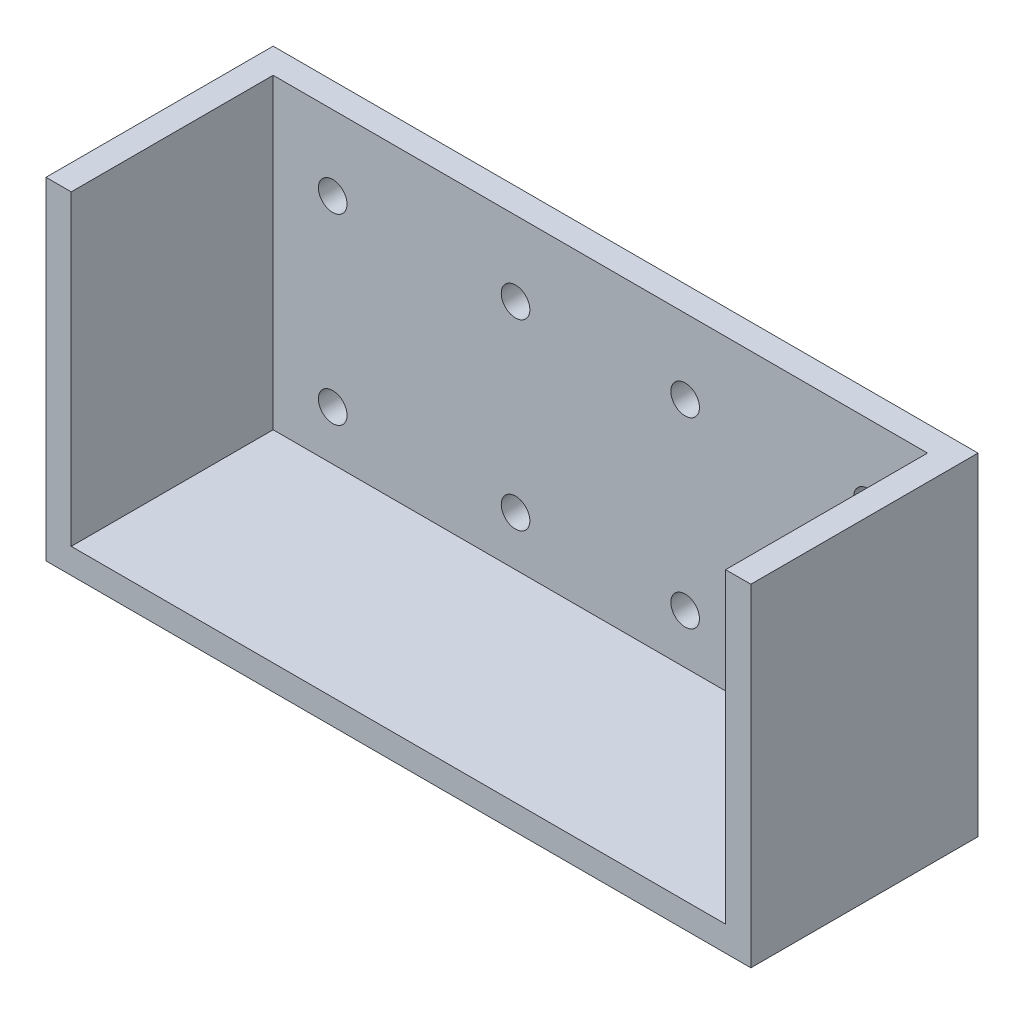
ISO-10303-21;
HEADER;
FILE_DESCRIPTION(('STEP AP214'),'2;1');
FILE_NAME('part.step','',(''),(''),'','','');
FILE_SCHEMA(('AUTOMOTIVE_DESIGN { 1 0 10303 214 1 1 1 1 }'));
ENDSEC;
DATA;
#1=APPLICATION_CONTEXT('core data for automotive mechanical design processes');
#2=APPLICATION_PROTOCOL_DEFINITION('international standard','automotive_design',2000,#1);
#3=PRODUCT_CONTEXT('',#1,'mechanical');
#4=PRODUCT('Part','Part','',(#3));
#5=PRODUCT_RELATED_PRODUCT_CATEGORY('part','',(#4));
#6=PRODUCT_DEFINITION_FORMATION('','',#4);
#7=PRODUCT_DEFINITION_CONTEXT('part definition',#1,'design');
#8=PRODUCT_DEFINITION('design','',#6,#7);
#9=PRODUCT_DEFINITION_SHAPE('','',#8);
#10=(LENGTH_UNIT() NAMED_UNIT(*) SI_UNIT(.MILLI.,.METRE.));
#11=(NAMED_UNIT(*) PLANE_ANGLE_UNIT() SI_UNIT($,.RADIAN.));
#12=(NAMED_UNIT(*) SI_UNIT($,.STERADIAN.) SOLID_ANGLE_UNIT());
#13=UNCERTAINTY_MEASURE_WITH_UNIT(LENGTH_MEASURE(1.E-05),#10,'distance_accuracy_value','');
#14=(GEOMETRIC_REPRESENTATION_CONTEXT(3) GLOBAL_UNCERTAINTY_ASSIGNED_CONTEXT((#13)) GLOBAL_UNIT_ASSIGNED_CONTEXT((#10,
#11,#12)) REPRESENTATION_CONTEXT('',''));
#15=CARTESIAN_POINT('',(0.,0.,0.));
#16=DIRECTION('',(0.,0.,1.));
#17=DIRECTION('',(1.,0.,0.));
#18=AXIS2_PLACEMENT_3D('',#15,#16,#17);
#19=CARTESIAN_POINT('',(-3.81,34.8107,3.175));
#20=DIRECTION('',(0.,-1.,0.));
#21=DIRECTION('',(0.,0.,-1.));
#22=AXIS2_PLACEMENT_3D('',#19,#20,#21);
#23=PLANE('',#22);
#24=DIRECTION('',(-1.,0.,0.));
#25=VECTOR('',#24,1.);
#26=CARTESIAN_POINT('',(-3.81,34.8107,0.));
#27=LINE('',#26,#25);
#28=CARTESIAN_POINT('',(81.68386,34.8107,0.));
#29=VERTEX_POINT('',#28);
#30=CARTESIAN_POINT('',(-6.985,34.8107,0.));
#31=VERTEX_POINT('',#30);
#32=EDGE_CURVE('E41',#29,#31,#27,.T.);
#33=ORIENTED_EDGE('',*,*,#32,.T.);
#34=DIRECTION('',(0.,0.,1.));
#35=VECTOR('',#34,1.);
#36=CARTESIAN_POINT('',(-6.985,34.8107,-98.0257480062744));
#37=LINE('',#36,#35);
#38=CARTESIAN_POINT('',(-6.985,34.8107,28.575));
#39=VERTEX_POINT('',#38);
#40=EDGE_CURVE('E99',#31,#39,#37,.T.);
#41=ORIENTED_EDGE('',*,*,#40,.T.);
#42=DIRECTION('',(-1.,0.,0.));
#43=VECTOR('',#42,1.);
#44=CARTESIAN_POINT('',(0.,34.8107,28.575));
#45=LINE('',#44,#43);
#46=CARTESIAN_POINT('',(-3.81,34.8107,28.575));
#47=VERTEX_POINT('',#46);
#48=EDGE_CURVE('E103',#47,#39,#45,.T.);
#49=ORIENTED_EDGE('',*,*,#48,.F.);
#50=DIRECTION('',(0.,0.,1.));
#51=VECTOR('',#50,1.);
#52=CARTESIAN_POINT('',(-3.81,34.8107,-98.0257480062744));
#53=LINE('',#52,#51);
#54=CARTESIAN_POINT('',(-3.81,34.8107,3.175));
#55=VERTEX_POINT('',#54);
#56=EDGE_CURVE('E110',#55,#47,#53,.T.);
#57=ORIENTED_EDGE('',*,*,#56,.F.);
#58=DIRECTION('',(-1.,0.,0.));
#59=VECTOR('',#58,1.);
#60=CARTESIAN_POINT('',(-3.81,34.8107,3.175));
#61=LINE('',#60,#59);
#62=CARTESIAN_POINT('',(78.50886,34.8107,3.175));
#63=VERTEX_POINT('',#62);
#64=EDGE_CURVE('E11',#63,#55,#61,.T.);
#65=ORIENTED_EDGE('',*,*,#64,.F.);
#66=DIRECTION('',(0.,0.,1.));
#67=VECTOR('',#66,1.);
#68=CARTESIAN_POINT('',(78.50886,34.8107,-98.0257480062744));
#69=LINE('',#68,#67);
#70=CARTESIAN_POINT('',(78.50886,34.8107,28.575));
#71=VERTEX_POINT('',#70);
#72=EDGE_CURVE('E175',#63,#71,#69,.T.);
#73=ORIENTED_EDGE('',*,*,#72,.T.);
#74=DIRECTION('',(1.,0.,0.));
#75=VECTOR('',#74,1.);
#76=CARTESIAN_POINT('',(0.,34.8107,28.575));
#77=LINE('',#76,#75);
#78=CARTESIAN_POINT('',(81.68386,34.8107,28.575));
#79=VERTEX_POINT('',#78);
#80=EDGE_CURVE('E142',#71,#79,#77,.T.);
#81=ORIENTED_EDGE('',*,*,#80,.T.);
#82=DIRECTION('',(0.,0.,1.));
#83=VECTOR('',#82,1.);
#84=CARTESIAN_POINT('',(81.68386,34.8107,-98.0257480062744));
#85=LINE('',#84,#83);
#86=EDGE_CURVE('E178',#29,#79,#85,.T.);
#87=ORIENTED_EDGE('',*,*,#86,.F.);
#88=EDGE_LOOP('',(#33,#41,#49,#57,#65,#73,#81,#87));
#89=FACE_BOUND('',#88,.T.);
#90=ADVANCED_FACE('F38',(#89),#23,.F.);
#91=CARTESIAN_POINT('',(0.,0.,3.175));
#92=DIRECTION('',(0.,0.,-1.));
#93=DIRECTION('',(-1.,0.,0.));
#94=AXIS2_PLACEMENT_3D('',#91,#92,#93);
#95=PLANE('',#94);
#96=CARTESIAN_POINT('',(71.016645,25.41285,3.175));
#97=DIRECTION('',(0.,0.,-1.));
#98=DIRECTION('',(-1.,0.,0.));
#99=AXIS2_PLACEMENT_3D('',#96,#97,#98);
#100=CIRCLE('',#99,1.79999999999999);
#101=CARTESIAN_POINT('',(69.216645,25.41285,3.175));
#102=VERTEX_POINT('',#101);
#103=EDGE_CURVE('E238',#102,#102,#100,.T.);
#104=ORIENTED_EDGE('',*,*,#103,.T.);
#105=EDGE_LOOP('',(#104));
#106=FACE_BOUND('',#105,.T.);
#107=CARTESIAN_POINT('',(71.016645,2.41284999999999,3.175));
#108=DIRECTION('',(0.,0.,-1.));
#109=DIRECTION('',(-1.,0.,0.));
#110=AXIS2_PLACEMENT_3D('',#107,#108,#109);
#111=CIRCLE('',#110,1.79999999999999);
#112=CARTESIAN_POINT('',(69.216645,2.41284999999999,3.175));
#113=VERTEX_POINT('',#112);
#114=EDGE_CURVE('E242',#113,#113,#111,.T.);
#115=ORIENTED_EDGE('',*,*,#114,.T.);
#116=EDGE_LOOP('',(#115));
#117=FACE_BOUND('',#116,.T.);
#118=CARTESIAN_POINT('',(3.68221500000001,2.41284999999999,3.175));
#119=DIRECTION('',(0.,0.,-1.));
#120=DIRECTION('',(-1.,0.,0.));
#121=AXIS2_PLACEMENT_3D('',#118,#119,#120);
#122=CIRCLE('',#121,1.79999999999999);
#123=CARTESIAN_POINT('',(1.88221500000002,2.41284999999999,3.175));
#124=VERTEX_POINT('',#123);
#125=EDGE_CURVE('E246',#124,#124,#122,.T.);
#126=ORIENTED_EDGE('',*,*,#125,.T.);
#127=EDGE_LOOP('',(#126));
#128=FACE_BOUND('',#127,.T.);
#129=CARTESIAN_POINT('',(26.682215,2.41284999999999,3.175));
#130=DIRECTION('',(0.,0.,-1.));
#131=DIRECTION('',(-1.,0.,0.));
#132=AXIS2_PLACEMENT_3D('',#129,#130,#131);
#133=CIRCLE('',#132,1.79999999999999);
#134=CARTESIAN_POINT('',(24.882215,2.41284999999999,3.175));
#135=VERTEX_POINT('',#134);
#136=EDGE_CURVE('E250',#135,#135,#133,.T.);
#137=ORIENTED_EDGE('',*,*,#136,.T.);
#138=EDGE_LOOP('',(#137));
#139=FACE_BOUND('',#138,.T.);
#140=CARTESIAN_POINT('',(48.016645,2.41284999999999,3.175));
#141=DIRECTION('',(0.,0.,-1.));
#142=DIRECTION('',(-1.,0.,0.));
#143=AXIS2_PLACEMENT_3D('',#140,#141,#142);
#144=CIRCLE('',#143,1.79999999999999);
#145=CARTESIAN_POINT('',(46.216645,2.41284999999999,3.175));
#146=VERTEX_POINT('',#145);
#147=EDGE_CURVE('E254',#146,#146,#144,.T.);
#148=ORIENTED_EDGE('',*,*,#147,.T.);
#149=EDGE_LOOP('',(#148));
#150=FACE_BOUND('',#149,.T.);
#151=CARTESIAN_POINT('',(48.016645,25.41285,3.175));
#152=DIRECTION('',(0.,0.,-1.));
#153=DIRECTION('',(-1.,0.,0.));
#154=AXIS2_PLACEMENT_3D('',#151,#152,#153);
#155=CIRCLE('',#154,1.79999999999999);
#156=CARTESIAN_POINT('',(46.216645,25.41285,3.175));
#157=VERTEX_POINT('',#156);
#158=EDGE_CURVE('E258',#157,#157,#155,.T.);
#159=ORIENTED_EDGE('',*,*,#158,.T.);
#160=EDGE_LOOP('',(#159));
#161=FACE_BOUND('',#160,.T.);
#162=CARTESIAN_POINT('',(26.682215,25.41285,3.175));
#163=DIRECTION('',(0.,0.,-1.));
#164=DIRECTION('',(-1.,0.,0.));
#165=AXIS2_PLACEMENT_3D('',#162,#163,#164);
#166=CIRCLE('',#165,1.79999999999999);
#167=CARTESIAN_POINT('',(24.882215,25.41285,3.175));
#168=VERTEX_POINT('',#167);
#169=EDGE_CURVE('E262',#168,#168,#166,.T.);
#170=ORIENTED_EDGE('',*,*,#169,.T.);
#171=EDGE_LOOP('',(#170));
#172=FACE_BOUND('',#171,.T.);
#173=CARTESIAN_POINT('',(3.68221500000001,25.41285,3.175));
#174=DIRECTION('',(0.,0.,-1.));
#175=DIRECTION('',(-1.,0.,0.));
#176=AXIS2_PLACEMENT_3D('',#173,#174,#175);
#177=CIRCLE('',#176,1.79999999999999);
#178=CARTESIAN_POINT('',(1.88221500000002,25.41285,3.175));
#179=VERTEX_POINT('',#178);
#180=EDGE_CURVE('E128',#179,#179,#177,.T.);
#181=ORIENTED_EDGE('',*,*,#180,.T.);
#182=EDGE_LOOP('',(#181));
#183=FACE_BOUND('',#182,.T.);
#184=DIRECTION('',(0.,-1.,0.));
#185=VECTOR('',#184,1.);
#186=CARTESIAN_POINT('',(-3.81,-3.81,3.175));
#187=LINE('',#186,#185);
#188=CARTESIAN_POINT('',(-3.81,-3.81,3.175));
#189=VERTEX_POINT('',#188);
#190=EDGE_CURVE('E185',#55,#189,#187,.T.);
#191=ORIENTED_EDGE('',*,*,#190,.T.);
#192=DIRECTION('',(1.,0.,0.));
#193=VECTOR('',#192,1.);
#194=CARTESIAN_POINT('',(-3.81,-3.81,3.175));
#195=LINE('',#194,#193);
#196=CARTESIAN_POINT('',(78.50886,-3.81,3.175));
#197=VERTEX_POINT('',#196);
#198=EDGE_CURVE('E188',#189,#197,#195,.T.);
#199=ORIENTED_EDGE('',*,*,#198,.T.);
#200=DIRECTION('',(0.,1.,0.));
#201=VECTOR('',#200,1.);
#202=CARTESIAN_POINT('',(78.50886,-3.81,3.175));
#203=LINE('',#202,#201);
#204=EDGE_CURVE('E47',#197,#63,#203,.T.);
#205=ORIENTED_EDGE('',*,*,#204,.T.);
#206=ORIENTED_EDGE('',*,*,#64,.T.);
#207=EDGE_LOOP('',(#191,#199,#205,#206));
#208=FACE_BOUND('',#207,.T.);
#209=ADVANCED_FACE('F194',(#106,#117,#128,#139,#150,#161,#172,#183,#208),#95,.F.);
#210=CARTESIAN_POINT('',(0.,0.,0.));
#211=DIRECTION('',(0.,0.,-1.));
#212=DIRECTION('',(-1.,0.,0.));
#213=AXIS2_PLACEMENT_3D('',#210,#211,#212);
#214=PLANE('',#213);
#215=CARTESIAN_POINT('',(71.016645,25.41285,0.));
#216=DIRECTION('',(0.,0.,-1.));
#217=DIRECTION('',(-1.,0.,0.));
#218=AXIS2_PLACEMENT_3D('',#215,#216,#217);
#219=CIRCLE('',#218,1.79999999999998);
#220=CARTESIAN_POINT('',(69.216645,25.41285,0.));
#221=VERTEX_POINT('',#220);
#222=EDGE_CURVE('E399',#221,#221,#219,.T.);
#223=ORIENTED_EDGE('',*,*,#222,.F.);
#224=EDGE_LOOP('',(#223));
#225=FACE_BOUND('',#224,.T.);
#226=CARTESIAN_POINT('',(71.016645,2.41284999999999,0.));
#227=DIRECTION('',(0.,0.,-1.));
#228=DIRECTION('',(-1.,0.,0.));
#229=AXIS2_PLACEMENT_3D('',#226,#227,#228);
#230=CIRCLE('',#229,1.79999999999998);
#231=CARTESIAN_POINT('',(69.216645,2.41284999999999,0.));
#232=VERTEX_POINT('',#231);
#233=EDGE_CURVE('E401',#232,#232,#230,.T.);
#234=ORIENTED_EDGE('',*,*,#233,.F.);
#235=EDGE_LOOP('',(#234));
#236=FACE_BOUND('',#235,.T.);
#237=CARTESIAN_POINT('',(3.68221500000001,2.41284999999999,0.));
#238=DIRECTION('',(0.,0.,-1.));
#239=DIRECTION('',(-1.,0.,0.));
#240=AXIS2_PLACEMENT_3D('',#237,#238,#239);
#241=CIRCLE('',#240,1.79999999999999);
#242=CARTESIAN_POINT('',(1.88221500000002,2.41284999999999,0.));
#243=VERTEX_POINT('',#242);
#244=EDGE_CURVE('E411',#243,#243,#241,.T.);
#245=ORIENTED_EDGE('',*,*,#244,.F.);
#246=EDGE_LOOP('',(#245));
#247=FACE_BOUND('',#246,.T.);
#248=CARTESIAN_POINT('',(26.682215,2.41284999999999,0.));
#249=DIRECTION('',(0.,0.,-1.));
#250=DIRECTION('',(-1.,0.,0.));
#251=AXIS2_PLACEMENT_3D('',#248,#249,#250);
#252=CIRCLE('',#251,1.79999999999999);
#253=CARTESIAN_POINT('',(24.882215,2.41284999999999,0.));
#254=VERTEX_POINT('',#253);
#255=EDGE_CURVE('E417',#254,#254,#252,.T.);
#256=ORIENTED_EDGE('',*,*,#255,.F.);
#257=EDGE_LOOP('',(#256));
#258=FACE_BOUND('',#257,.T.);
#259=CARTESIAN_POINT('',(48.016645,2.41284999999999,0.));
#260=DIRECTION('',(0.,0.,-1.));
#261=DIRECTION('',(-1.,0.,0.));
#262=AXIS2_PLACEMENT_3D('',#259,#260,#261);
#263=CIRCLE('',#262,1.79999999999999);
#264=CARTESIAN_POINT('',(46.216645,2.41284999999999,0.));
#265=VERTEX_POINT('',#264);
#266=EDGE_CURVE('E423',#265,#265,#263,.T.);
#267=ORIENTED_EDGE('',*,*,#266,.F.);
#268=EDGE_LOOP('',(#267));
#269=FACE_BOUND('',#268,.T.);
#270=CARTESIAN_POINT('',(48.016645,25.41285,0.));
#271=DIRECTION('',(0.,0.,-1.));
#272=DIRECTION('',(-1.,0.,0.));
#273=AXIS2_PLACEMENT_3D('',#270,#271,#272);
#274=CIRCLE('',#273,1.79999999999999);
#275=CARTESIAN_POINT('',(46.216645,25.41285,0.));
#276=VERTEX_POINT('',#275);
#277=EDGE_CURVE('E429',#276,#276,#274,.T.);
#278=ORIENTED_EDGE('',*,*,#277,.F.);
#279=EDGE_LOOP('',(#278));
#280=FACE_BOUND('',#279,.T.);
#281=CARTESIAN_POINT('',(26.682215,25.41285,0.));
#282=DIRECTION('',(0.,0.,-1.));
#283=DIRECTION('',(-1.,0.,0.));
#284=AXIS2_PLACEMENT_3D('',#281,#282,#283);
#285=CIRCLE('',#284,1.79999999999999);
#286=CARTESIAN_POINT('',(24.882215,25.41285,0.));
#287=VERTEX_POINT('',#286);
#288=EDGE_CURVE('E435',#287,#287,#285,.T.);
#289=ORIENTED_EDGE('',*,*,#288,.F.);
#290=EDGE_LOOP('',(#289));
#291=FACE_BOUND('',#290,.T.);
#292=CARTESIAN_POINT('',(3.68221500000001,25.41285,0.));
#293=DIRECTION('',(0.,0.,-1.));
#294=DIRECTION('',(-1.,0.,0.));
#295=AXIS2_PLACEMENT_3D('',#292,#293,#294);
#296=CIRCLE('',#295,1.79999999999999);
#297=CARTESIAN_POINT('',(1.88221500000002,25.41285,0.));
#298=VERTEX_POINT('',#297);
#299=EDGE_CURVE('E132',#298,#298,#296,.T.);
#300=ORIENTED_EDGE('',*,*,#299,.F.);
#301=EDGE_LOOP('',(#300));
#302=FACE_BOUND('',#301,.T.);
#303=ORIENTED_EDGE('',*,*,#32,.F.);
#304=DIRECTION('',(0.,-1.,0.));
#305=VECTOR('',#304,1.);
#306=CARTESIAN_POINT('',(81.68386,0.,0.));
#307=LINE('',#306,#305);
#308=CARTESIAN_POINT('',(81.68386,-6.985,0.));
#309=VERTEX_POINT('',#308);
#310=EDGE_CURVE('E156',#29,#309,#307,.T.);
#311=ORIENTED_EDGE('',*,*,#310,.T.);
#312=DIRECTION('',(1.,0.,0.));
#313=VECTOR('',#312,1.);
#314=CARTESIAN_POINT('',(0.,-6.985,0.));
#315=LINE('',#314,#313);
#316=CARTESIAN_POINT('',(-6.985,-6.985,0.));
#317=VERTEX_POINT('',#316);
#318=EDGE_CURVE('E162',#317,#309,#315,.T.);
#319=ORIENTED_EDGE('',*,*,#318,.F.);
#320=DIRECTION('',(0.,-1.,0.));
#321=VECTOR('',#320,1.);
#322=CARTESIAN_POINT('',(-6.985,0.,0.));
#323=LINE('',#322,#321);
#324=EDGE_CURVE('E157',#31,#317,#323,.T.);
#325=ORIENTED_EDGE('',*,*,#324,.F.);
#326=EDGE_LOOP('',(#303,#311,#319,#325));
#327=FACE_BOUND('',#326,.T.);
#328=ADVANCED_FACE('F212',(#225,#236,#247,#258,#269,#280,#291,#302,#327),#214,.T.);
#329=CARTESIAN_POINT('',(78.50886,0.,-98.0257480062744));
#330=DIRECTION('',(1.,0.,0.));
#331=DIRECTION('',(0.,0.,-1.));
#332=AXIS2_PLACEMENT_3D('',#329,#330,#331);
#333=PLANE('',#332);
#334=ORIENTED_EDGE('',*,*,#72,.F.);
#335=ORIENTED_EDGE('',*,*,#204,.F.);
#336=DIRECTION('',(0.,0.,1.));
#337=VECTOR('',#336,1.);
#338=CARTESIAN_POINT('',(78.50886,-3.81,-98.0257480062744));
#339=LINE('',#338,#337);
#340=CARTESIAN_POINT('',(78.50886,-3.81,28.575));
#341=VERTEX_POINT('',#340);
#342=EDGE_CURVE('E172',#197,#341,#339,.T.);
#343=ORIENTED_EDGE('',*,*,#342,.T.);
#344=DIRECTION('',(0.,1.,0.));
#345=VECTOR('',#344,1.);
#346=CARTESIAN_POINT('',(78.50886,0.,28.575));
#347=LINE('',#346,#345);
#348=EDGE_CURVE('E146',#341,#71,#347,.T.);
#349=ORIENTED_EDGE('',*,*,#348,.T.);
#350=EDGE_LOOP('',(#334,#335,#343,#349));
#351=FACE_BOUND('',#350,.T.);
#352=ADVANCED_FACE('F200',(#351),#333,.F.);
#353=CARTESIAN_POINT('',(0.,-3.81,-98.0257480062744));
#354=DIRECTION('',(0.,-1.,0.));
#355=DIRECTION('',(0.,0.,-1.));
#356=AXIS2_PLACEMENT_3D('',#353,#354,#355);
#357=PLANE('',#356);
#358=ORIENTED_EDGE('',*,*,#342,.F.);
#359=ORIENTED_EDGE('',*,*,#198,.F.);
#360=DIRECTION('',(0.,0.,1.));
#361=VECTOR('',#360,1.);
#362=CARTESIAN_POINT('',(-3.81,-3.81,-98.0257480062744));
#363=LINE('',#362,#361);
#364=CARTESIAN_POINT('',(-3.81,-3.81,28.575));
#365=VERTEX_POINT('',#364);
#366=EDGE_CURVE('E169',#189,#365,#363,.T.);
#367=ORIENTED_EDGE('',*,*,#366,.T.);
#368=DIRECTION('',(1.,0.,0.));
#369=VECTOR('',#368,1.);
#370=CARTESIAN_POINT('',(0.,-3.81,28.575));
#371=LINE('',#370,#369);
#372=EDGE_CURVE('E150',#365,#341,#371,.T.);
#373=ORIENTED_EDGE('',*,*,#372,.T.);
#374=EDGE_LOOP('',(#358,#359,#367,#373));
#375=FACE_BOUND('',#374,.T.);
#376=ADVANCED_FACE('F202',(#375),#357,.F.);
#377=CARTESIAN_POINT('',(-3.81,0.,-98.0257480062744));
#378=DIRECTION('',(-1.,0.,0.));
#379=DIRECTION('',(0.,0.,1.));
#380=AXIS2_PLACEMENT_3D('',#377,#378,#379);
#381=PLANE('',#380);
#382=ORIENTED_EDGE('',*,*,#366,.F.);
#383=ORIENTED_EDGE('',*,*,#190,.F.);
#384=ORIENTED_EDGE('',*,*,#56,.T.);
#385=DIRECTION('',(0.,-1.,0.));
#386=VECTOR('',#385,1.);
#387=CARTESIAN_POINT('',(-3.81,0.,28.575));
#388=LINE('',#387,#386);
#389=EDGE_CURVE('E126',#47,#365,#388,.T.);
#390=ORIENTED_EDGE('',*,*,#389,.T.);
#391=EDGE_LOOP('',(#382,#383,#384,#390));
#392=FACE_BOUND('',#391,.T.);
#393=ADVANCED_FACE('F205',(#392),#381,.F.);
#394=CARTESIAN_POINT('',(-6.985,0.,-98.0257480062744));
#395=DIRECTION('',(-1.,0.,0.));
#396=DIRECTION('',(0.,-1.,0.));
#397=AXIS2_PLACEMENT_3D('',#394,#395,#396);
#398=PLANE('',#397);
#399=ORIENTED_EDGE('',*,*,#40,.F.);
#400=ORIENTED_EDGE('',*,*,#324,.T.);
#401=DIRECTION('',(0.,0.,1.));
#402=VECTOR('',#401,1.);
#403=CARTESIAN_POINT('',(-6.985,-6.985,-98.0257480062744));
#404=LINE('',#403,#402);
#405=CARTESIAN_POINT('',(-6.985,-6.985,28.575));
#406=VERTEX_POINT('',#405);
#407=EDGE_CURVE('E116',#317,#406,#404,.T.);
#408=ORIENTED_EDGE('',*,*,#407,.T.);
#409=DIRECTION('',(0.,-1.,0.));
#410=VECTOR('',#409,1.);
#411=CARTESIAN_POINT('',(-6.985,0.,28.575));
#412=LINE('',#411,#410);
#413=EDGE_CURVE('E113',#39,#406,#412,.T.);
#414=ORIENTED_EDGE('',*,*,#413,.F.);
#415=EDGE_LOOP('',(#399,#400,#408,#414));
#416=FACE_BOUND('',#415,.T.);
#417=ADVANCED_FACE('F114',(#416),#398,.T.);
#418=CARTESIAN_POINT('',(0.,-6.985,-98.0257480062744));
#419=DIRECTION('',(0.,-1.,0.));
#420=DIRECTION('',(0.,0.,-1.));
#421=AXIS2_PLACEMENT_3D('',#418,#419,#420);
#422=PLANE('',#421);
#423=ORIENTED_EDGE('',*,*,#407,.F.);
#424=ORIENTED_EDGE('',*,*,#318,.T.);
#425=DIRECTION('',(0.,0.,1.));
#426=VECTOR('',#425,1.);
#427=CARTESIAN_POINT('',(81.68386,-6.985,-98.0257480062744));
#428=LINE('',#427,#426);
#429=CARTESIAN_POINT('',(81.68386,-6.985,28.575));
#430=VERTEX_POINT('',#429);
#431=EDGE_CURVE('E166',#309,#430,#428,.T.);
#432=ORIENTED_EDGE('',*,*,#431,.T.);
#433=DIRECTION('',(1.,0.,0.));
#434=VECTOR('',#433,1.);
#435=CARTESIAN_POINT('',(0.,-6.985,28.575));
#436=LINE('',#435,#434);
#437=EDGE_CURVE('E121',#406,#430,#436,.T.);
#438=ORIENTED_EDGE('',*,*,#437,.F.);
#439=EDGE_LOOP('',(#423,#424,#432,#438));
#440=FACE_BOUND('',#439,.T.);
#441=ADVANCED_FACE('F214',(#440),#422,.T.);
#442=CARTESIAN_POINT('',(81.68386,0.,-98.0257480062744));
#443=DIRECTION('',(-1.,0.,0.));
#444=DIRECTION('',(0.,0.,1.));
#445=AXIS2_PLACEMENT_3D('',#442,#443,#444);
#446=PLANE('',#445);
#447=ORIENTED_EDGE('',*,*,#310,.F.);
#448=ORIENTED_EDGE('',*,*,#86,.T.);
#449=DIRECTION('',(0.,-1.,0.));
#450=VECTOR('',#449,1.);
#451=CARTESIAN_POINT('',(81.68386,0.,28.575));
#452=LINE('',#451,#450);
#453=EDGE_CURVE('E138',#79,#430,#452,.T.);
#454=ORIENTED_EDGE('',*,*,#453,.T.);
#455=ORIENTED_EDGE('',*,*,#431,.F.);
#456=EDGE_LOOP('',(#447,#448,#454,#455));
#457=FACE_BOUND('',#456,.T.);
#458=ADVANCED_FACE('F210',(#457),#446,.F.);
#459=CARTESIAN_POINT('',(0.,0.,28.575));
#460=DIRECTION('',(0.,0.,1.));
#461=DIRECTION('',(1.,0.,0.));
#462=AXIS2_PLACEMENT_3D('',#459,#460,#461);
#463=PLANE('',#462);
#464=ORIENTED_EDGE('',*,*,#48,.T.);
#465=ORIENTED_EDGE('',*,*,#413,.T.);
#466=ORIENTED_EDGE('',*,*,#437,.T.);
#467=ORIENTED_EDGE('',*,*,#453,.F.);
#468=ORIENTED_EDGE('',*,*,#80,.F.);
#469=ORIENTED_EDGE('',*,*,#348,.F.);
#470=ORIENTED_EDGE('',*,*,#372,.F.);
#471=ORIENTED_EDGE('',*,*,#389,.F.);
#472=EDGE_LOOP('',(#464,#465,#466,#467,#468,#469,#470,#471));
#473=FACE_BOUND('',#472,.T.);
#474=ADVANCED_FACE('F123',(#473),#463,.T.);
#475=CARTESIAN_POINT('',(3.68221500000001,25.41285,0.));
#476=DIRECTION('',(0.,0.,-1.));
#477=DIRECTION('',(-1.,0.,0.));
#478=AXIS2_PLACEMENT_3D('',#475,#476,#477);
#479=CYLINDRICAL_SURFACE('',#478,1.79999999999999);
#480=ORIENTED_EDGE('',*,*,#299,.T.);
#481=EDGE_LOOP('',(#480));
#482=FACE_BOUND('',#481,.T.);
#483=ORIENTED_EDGE('',*,*,#180,.F.);
#484=EDGE_LOOP('',(#483));
#485=FACE_BOUND('',#484,.T.);
#486=ADVANCED_FACE('F265',(#482,#485),#479,.F.);
#487=CARTESIAN_POINT('',(26.682215,25.41285,0.));
#488=DIRECTION('',(0.,0.,-1.));
#489=DIRECTION('',(-1.,0.,0.));
#490=AXIS2_PLACEMENT_3D('',#487,#488,#489);
#491=CYLINDRICAL_SURFACE('',#490,1.79999999999999);
#492=ORIENTED_EDGE('',*,*,#288,.T.);
#493=EDGE_LOOP('',(#492));
#494=FACE_BOUND('',#493,.T.);
#495=ORIENTED_EDGE('',*,*,#169,.F.);
#496=EDGE_LOOP('',(#495));
#497=FACE_BOUND('',#496,.T.);
#498=ADVANCED_FACE('F267',(#494,#497),#491,.F.);
#499=CARTESIAN_POINT('',(48.016645,25.41285,0.));
#500=DIRECTION('',(0.,0.,-1.));
#501=DIRECTION('',(-1.,0.,0.));
#502=AXIS2_PLACEMENT_3D('',#499,#500,#501);
#503=CYLINDRICAL_SURFACE('',#502,1.79999999999999);
#504=ORIENTED_EDGE('',*,*,#277,.T.);
#505=EDGE_LOOP('',(#504));
#506=FACE_BOUND('',#505,.T.);
#507=ORIENTED_EDGE('',*,*,#158,.F.);
#508=EDGE_LOOP('',(#507));
#509=FACE_BOUND('',#508,.T.);
#510=ADVANCED_FACE('F274',(#506,#509),#503,.F.);
#511=CARTESIAN_POINT('',(48.016645,2.41284999999999,0.));
#512=DIRECTION('',(0.,0.,-1.));
#513=DIRECTION('',(-1.,0.,0.));
#514=AXIS2_PLACEMENT_3D('',#511,#512,#513);
#515=CYLINDRICAL_SURFACE('',#514,1.79999999999999);
#516=ORIENTED_EDGE('',*,*,#266,.T.);
#517=EDGE_LOOP('',(#516));
#518=FACE_BOUND('',#517,.T.);
#519=ORIENTED_EDGE('',*,*,#147,.F.);
#520=EDGE_LOOP('',(#519));
#521=FACE_BOUND('',#520,.T.);
#522=ADVANCED_FACE('F343',(#518,#521),#515,.F.);
#523=CARTESIAN_POINT('',(26.682215,2.41284999999999,0.));
#524=DIRECTION('',(0.,0.,-1.));
#525=DIRECTION('',(-1.,0.,0.));
#526=AXIS2_PLACEMENT_3D('',#523,#524,#525);
#527=CYLINDRICAL_SURFACE('',#526,1.79999999999999);
#528=ORIENTED_EDGE('',*,*,#255,.T.);
#529=EDGE_LOOP('',(#528));
#530=FACE_BOUND('',#529,.T.);
#531=ORIENTED_EDGE('',*,*,#136,.F.);
#532=EDGE_LOOP('',(#531));
#533=FACE_BOUND('',#532,.T.);
#534=ADVANCED_FACE('F351',(#530,#533),#527,.F.);
#535=CARTESIAN_POINT('',(3.68221500000001,2.41284999999999,0.));
#536=DIRECTION('',(0.,0.,-1.));
#537=DIRECTION('',(-1.,0.,0.));
#538=AXIS2_PLACEMENT_3D('',#535,#536,#537);
#539=CYLINDRICAL_SURFACE('',#538,1.79999999999999);
#540=ORIENTED_EDGE('',*,*,#244,.T.);
#541=EDGE_LOOP('',(#540));
#542=FACE_BOUND('',#541,.T.);
#543=ORIENTED_EDGE('',*,*,#125,.F.);
#544=EDGE_LOOP('',(#543));
#545=FACE_BOUND('',#544,.T.);
#546=ADVANCED_FACE('F360',(#542,#545),#539,.F.);
#547=CARTESIAN_POINT('',(71.016645,2.41284999999999,0.));
#548=DIRECTION('',(0.,0.,-1.));
#549=DIRECTION('',(-1.,0.,0.));
#550=AXIS2_PLACEMENT_3D('',#547,#548,#549);
#551=CYLINDRICAL_SURFACE('',#550,1.79999999999999);
#552=ORIENTED_EDGE('',*,*,#233,.T.);
#553=EDGE_LOOP('',(#552));
#554=FACE_BOUND('',#553,.T.);
#555=ORIENTED_EDGE('',*,*,#114,.F.);
#556=EDGE_LOOP('',(#555));
#557=FACE_BOUND('',#556,.T.);
#558=ADVANCED_FACE('F369',(#554,#557),#551,.F.);
#559=CARTESIAN_POINT('',(71.016645,25.41285,0.));
#560=DIRECTION('',(0.,0.,-1.));
#561=DIRECTION('',(-1.,0.,0.));
#562=AXIS2_PLACEMENT_3D('',#559,#560,#561);
#563=CYLINDRICAL_SURFACE('',#562,1.79999999999999);
#564=ORIENTED_EDGE('',*,*,#222,.T.);
#565=EDGE_LOOP('',(#564));
#566=FACE_BOUND('',#565,.T.);
#567=ORIENTED_EDGE('',*,*,#103,.F.);
#568=EDGE_LOOP('',(#567));
#569=FACE_BOUND('',#568,.T.);
#570=ADVANCED_FACE('F378',(#566,#569),#563,.F.);
#571=CLOSED_SHELL('',(#90,#209,#328,#352,#376,#393,#417,#441,#458,#474,#486,#498,#510,#522,#534,
#546,#558,#570));
#572=MANIFOLD_SOLID_BREP('B2',#571);
#573=ADVANCED_BREP_SHAPE_REPRESENTATION('',(#18,#572),#14);
#574=SHAPE_DEFINITION_REPRESENTATION(#9,#573);
ENDSEC;
END-ISO-10303-21;
